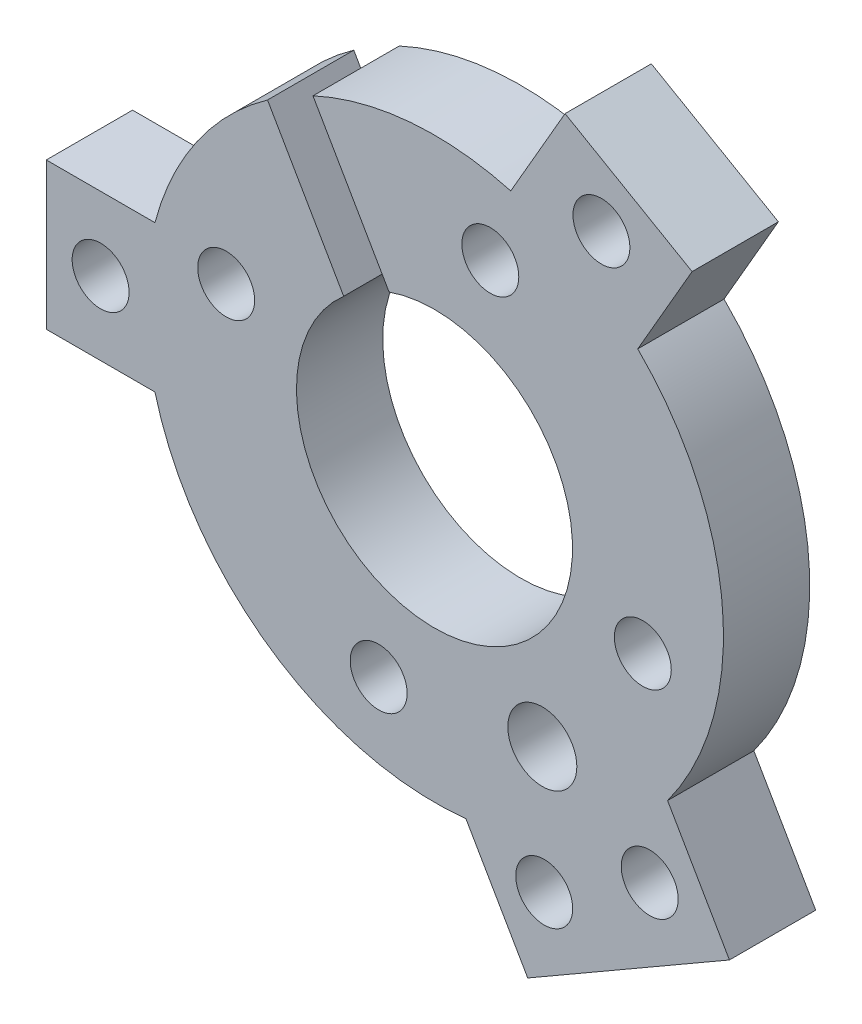
ISO-10303-21;
HEADER;
FILE_DESCRIPTION(('STEP AP214'),'2;1');
FILE_NAME('part.step','',(''),(''),'','','');
FILE_SCHEMA(('AUTOMOTIVE_DESIGN { 1 0 10303 214 1 1 1 1 }'));
ENDSEC;
DATA;
#1=APPLICATION_CONTEXT('core data for automotive mechanical design processes');
#2=APPLICATION_PROTOCOL_DEFINITION('international standard','automotive_design',2000,#1);
#3=PRODUCT_CONTEXT('',#1,'mechanical');
#4=PRODUCT('Part','Part','',(#3));
#5=PRODUCT_RELATED_PRODUCT_CATEGORY('part','',(#4));
#6=PRODUCT_DEFINITION_FORMATION('','',#4);
#7=PRODUCT_DEFINITION_CONTEXT('part definition',#1,'design');
#8=PRODUCT_DEFINITION('design','',#6,#7);
#9=PRODUCT_DEFINITION_SHAPE('','',#8);
#10=(LENGTH_UNIT() NAMED_UNIT(*) SI_UNIT(.MILLI.,.METRE.));
#11=(NAMED_UNIT(*) PLANE_ANGLE_UNIT() SI_UNIT($,.RADIAN.));
#12=(NAMED_UNIT(*) SI_UNIT($,.STERADIAN.) SOLID_ANGLE_UNIT());
#13=UNCERTAINTY_MEASURE_WITH_UNIT(LENGTH_MEASURE(1.E-05),#10,'distance_accuracy_value','');
#14=(GEOMETRIC_REPRESENTATION_CONTEXT(3) GLOBAL_UNCERTAINTY_ASSIGNED_CONTEXT((#13)) GLOBAL_UNIT_ASSIGNED_CONTEXT((#10,
#11,#12)) REPRESENTATION_CONTEXT('',''));
#15=CARTESIAN_POINT('',(0.,0.,0.));
#16=DIRECTION('',(0.,0.,1.));
#17=DIRECTION('',(1.,0.,0.));
#18=AXIS2_PLACEMENT_3D('',#15,#16,#17);
#19=CARTESIAN_POINT('',(0.,0.,10.));
#20=DIRECTION('',(0.,0.,-1.));
#21=DIRECTION('',(-1.,0.,0.));
#22=AXIS2_PLACEMENT_3D('',#19,#20,#21);
#23=CYLINDRICAL_SURFACE('',#22,33.5);
#24=DIRECTION('',(0.,0.,-1.));
#25=VECTOR('',#24,1.);
#26=CARTESIAN_POINT('',(-14.0867530310639,30.3942986272395,10.));
#27=LINE('',#26,#25);
#28=CARTESIAN_POINT('',(-14.0867530310639,30.3942986272395,10.));
#29=VERTEX_POINT('',#28);
#30=CARTESIAN_POINT('',(-14.0867530310639,30.3942986272395,0.));
#31=VERTEX_POINT('',#30);
#32=EDGE_CURVE('E80',#29,#31,#27,.T.);
#33=ORIENTED_EDGE('',*,*,#32,.F.);
#34=CARTESIAN_POINT('',(0.,0.,10.));
#35=DIRECTION('',(0.,0.,1.));
#36=DIRECTION('',(1.,0.,0.));
#37=AXIS2_PLACEMENT_3D('',#34,#35,#36);
#38=CIRCLE('',#37,33.5);
#39=CARTESIAN_POINT('',(8.84063581385193,32.3124304008046,10.));
#40=VERTEX_POINT('',#39);
#41=EDGE_CURVE('E183',#40,#29,#38,.T.);
#42=ORIENTED_EDGE('',*,*,#41,.F.);
#43=DIRECTION('',(0.,0.,-1.));
#44=VECTOR('',#43,1.);
#45=CARTESIAN_POINT('',(8.84063581385193,32.3124304008046,10.));
#46=LINE('',#45,#44);
#47=CARTESIAN_POINT('',(8.84063581385193,32.3124304008046,0.));
#48=VERTEX_POINT('',#47);
#49=EDGE_CURVE('E235',#40,#48,#46,.T.);
#50=ORIENTED_EDGE('',*,*,#49,.T.);
#51=CARTESIAN_POINT('',(0.,0.,0.));
#52=DIRECTION('',(0.,0.,1.));
#53=DIRECTION('',(1.,0.,0.));
#54=AXIS2_PLACEMENT_3D('',#51,#52,#53);
#55=CIRCLE('',#54,33.5);
#56=EDGE_CURVE('E226',#48,#31,#55,.T.);
#57=ORIENTED_EDGE('',*,*,#56,.T.);
#58=EDGE_LOOP('',(#33,#42,#50,#57));
#59=FACE_BOUND('',#58,.T.);
#60=ADVANCED_FACE('F65',(#59),#23,.T.);
#61=CARTESIAN_POINT('',(-32.4037034920393,-8.5,0.));
#62=VERTEX_POINT('',#61);
#63=CARTESIAN_POINT('',(3.638366765666,-33.3018360947035,0.));
#64=VERTEX_POINT('',#63);
#65=EDGE_CURVE('E202',#62,#64,#55,.T.);
#66=ORIENTED_EDGE('',*,*,#65,.T.);
#67=DIRECTION('',(0.,0.,-1.));
#68=VECTOR('',#67,1.);
#69=CARTESIAN_POINT('',(3.638366765666,-33.3018360947035,10.));
#70=LINE('',#69,#68);
#71=CARTESIAN_POINT('',(3.638366765666,-33.3018360947035,10.));
#72=VERTEX_POINT('',#71);
#73=EDGE_CURVE('E250',#72,#64,#70,.T.);
#74=ORIENTED_EDGE('',*,*,#73,.F.);
#75=CARTESIAN_POINT('',(-32.4037034920393,-8.5,10.));
#76=VERTEX_POINT('',#75);
#77=EDGE_CURVE('E231',#76,#72,#38,.T.);
#78=ORIENTED_EDGE('',*,*,#77,.F.);
#79=DIRECTION('',(0.,0.,-1.));
#80=VECTOR('',#79,1.);
#81=CARTESIAN_POINT('',(-32.4037034920393,-8.5,10.));
#82=LINE('',#81,#80);
#83=EDGE_CURVE('E89',#76,#62,#82,.T.);
#84=ORIENTED_EDGE('',*,*,#83,.T.);
#85=EDGE_LOOP('',(#66,#74,#78,#84));
#86=FACE_BOUND('',#85,.T.);
#87=ADVANCED_FACE('F347',(#86),#23,.T.);
#88=CARTESIAN_POINT('',(-11.6913429510899,-6.75000000000002,10.));
#89=DIRECTION('',(0.866025403784438,0.500000000000001,0.));
#90=DIRECTION('',(-0.500000000000001,0.866025403784438,0.));
#91=AXIS2_PLACEMENT_3D('',#88,#89,#90);
#92=PLANE('',#91);
#93=DIRECTION('',(0.500000000000001,-0.866025403784438,0.));
#94=VECTOR('',#93,1.);
#95=CARTESIAN_POINT('',(-11.6913429510899,-6.75000000000002,0.));
#96=LINE('',#95,#94);
#97=CARTESIAN_POINT('',(10.8086570489101,-45.7211431702997,0.));
#98=VERTEX_POINT('',#97);
#99=EDGE_CURVE('E204',#64,#98,#96,.T.);
#100=ORIENTED_EDGE('',*,*,#99,.T.);
#101=DIRECTION('',(0.,0.,-1.));
#102=VECTOR('',#101,1.);
#103=CARTESIAN_POINT('',(10.8086570489101,-45.7211431702997,10.));
#104=LINE('',#103,#102);
#105=CARTESIAN_POINT('',(10.8086570489101,-45.7211431702997,10.));
#106=VERTEX_POINT('',#105);
#107=EDGE_CURVE('E248',#106,#98,#104,.T.);
#108=ORIENTED_EDGE('',*,*,#107,.F.);
#109=DIRECTION('',(0.500000000000001,-0.866025403784438,0.));
#110=VECTOR('',#109,1.);
#111=CARTESIAN_POINT('',(-11.6913429510899,-6.75000000000002,10.));
#112=LINE('',#111,#110);
#113=EDGE_CURVE('E141',#72,#106,#112,.T.);
#114=ORIENTED_EDGE('',*,*,#113,.F.);
#115=ORIENTED_EDGE('',*,*,#73,.T.);
#116=EDGE_LOOP('',(#100,#108,#114,#115));
#117=FACE_BOUND('',#116,.T.);
#118=ADVANCED_FACE('F67',(#117),#92,.F.);
#119=CARTESIAN_POINT('',(22.5,-38.9711431702997,10.));
#120=DIRECTION('',(0.5,-0.866025403784438,0.));
#121=DIRECTION('',(0.866025403784439,0.5,0.));
#122=AXIS2_PLACEMENT_3D('',#119,#120,#121);
#123=PLANE('',#122);
#124=DIRECTION('',(-0.866025403784439,-0.5,0.));
#125=VECTOR('',#124,1.);
#126=CARTESIAN_POINT('',(22.5,-38.9711431702997,0.));
#127=LINE('',#126,#125);
#128=CARTESIAN_POINT('',(34.1913429510899,-32.2211431702997,0.));
#129=VERTEX_POINT('',#128);
#130=EDGE_CURVE('E210',#129,#98,#127,.T.);
#131=ORIENTED_EDGE('',*,*,#130,.F.);
#132=DIRECTION('',(0.,0.,-1.));
#133=VECTOR('',#132,1.);
#134=CARTESIAN_POINT('',(34.1913429510899,-32.2211431702997,10.));
#135=LINE('',#134,#133);
#136=CARTESIAN_POINT('',(34.1913429510899,-32.2211431702997,10.));
#137=VERTEX_POINT('',#136);
#138=EDGE_CURVE('E246',#137,#129,#135,.T.);
#139=ORIENTED_EDGE('',*,*,#138,.F.);
#140=DIRECTION('',(-0.866025403784439,-0.5,0.));
#141=VECTOR('',#140,1.);
#142=CARTESIAN_POINT('',(22.5,-38.9711431702997,10.));
#143=LINE('',#142,#141);
#144=EDGE_CURVE('E297',#137,#106,#143,.T.);
#145=ORIENTED_EDGE('',*,*,#144,.T.);
#146=ORIENTED_EDGE('',*,*,#107,.T.);
#147=EDGE_LOOP('',(#131,#139,#145,#146));
#148=FACE_BOUND('',#147,.T.);
#149=ADVANCED_FACE('F351',(#148),#123,.T.);
#150=CARTESIAN_POINT('',(11.69134295109,6.75,10.));
#151=DIRECTION('',(0.866025403784439,0.499999999999999,0.));
#152=DIRECTION('',(-0.499999999999999,0.866025403784439,0.));
#153=AXIS2_PLACEMENT_3D('',#150,#151,#152);
#154=PLANE('',#153);
#155=DIRECTION('',(0.499999999999999,-0.866025403784439,0.));
#156=VECTOR('',#155,1.);
#157=CARTESIAN_POINT('',(11.69134295109,6.75,0.));
#158=LINE('',#157,#156);
#159=CARTESIAN_POINT('',(27.0210526678458,-19.8018360947035,0.));
#160=VERTEX_POINT('',#159);
#161=EDGE_CURVE('E213',#160,#129,#158,.T.);
#162=ORIENTED_EDGE('',*,*,#161,.F.);
#163=DIRECTION('',(0.,0.,-1.));
#164=VECTOR('',#163,1.);
#165=CARTESIAN_POINT('',(27.0210526678458,-19.8018360947035,10.));
#166=LINE('',#165,#164);
#167=CARTESIAN_POINT('',(27.0210526678458,-19.8018360947035,10.));
#168=VERTEX_POINT('',#167);
#169=EDGE_CURVE('E244',#168,#160,#166,.T.);
#170=ORIENTED_EDGE('',*,*,#169,.F.);
#171=DIRECTION('',(0.499999999999999,-0.866025403784439,0.));
#172=VECTOR('',#171,1.);
#173=CARTESIAN_POINT('',(11.69134295109,6.75,10.));
#174=LINE('',#173,#172);
#175=EDGE_CURVE('E300',#168,#137,#174,.T.);
#176=ORIENTED_EDGE('',*,*,#175,.T.);
#177=ORIENTED_EDGE('',*,*,#138,.T.);
#178=EDGE_LOOP('',(#162,#170,#176,#177));
#179=FACE_BOUND('',#178,.T.);
#180=ADVANCED_FACE('F353',(#179),#154,.T.);
#181=CARTESIAN_POINT('',(23.5630676781874,23.8124304008046,0.));
#182=VERTEX_POINT('',#181);
#183=EDGE_CURVE('E207',#160,#182,#55,.T.);
#184=ORIENTED_EDGE('',*,*,#183,.T.);
#185=DIRECTION('',(0.,0.,-1.));
#186=VECTOR('',#185,1.);
#187=CARTESIAN_POINT('',(23.5630676781874,23.8124304008046,10.));
#188=LINE('',#187,#186);
#189=CARTESIAN_POINT('',(23.5630676781874,23.8124304008046,10.));
#190=VERTEX_POINT('',#189);
#191=EDGE_CURVE('E242',#190,#182,#188,.T.);
#192=ORIENTED_EDGE('',*,*,#191,.F.);
#193=EDGE_CURVE('E295',#168,#190,#38,.T.);
#194=ORIENTED_EDGE('',*,*,#193,.F.);
#195=ORIENTED_EDGE('',*,*,#169,.T.);
#196=EDGE_LOOP('',(#184,#192,#194,#195));
#197=FACE_BOUND('',#196,.T.);
#198=ADVANCED_FACE('F321',(#197),#23,.T.);
#199=CARTESIAN_POINT('',(7.36121593216774,-4.25,10.));
#200=DIRECTION('',(0.866025403784439,-0.5,0.));
#201=DIRECTION('',(0.5,0.866025403784439,0.));
#202=AXIS2_PLACEMENT_3D('',#199,#200,#201);
#203=PLANE('',#202);
#204=DIRECTION('',(-0.5,-0.866025403784439,0.));
#205=VECTOR('',#204,1.);
#206=CARTESIAN_POINT('',(7.36121593216774,-4.25,0.));
#207=LINE('',#206,#205);
#208=CARTESIAN_POINT('',(29.8612159321677,34.7211431702997,0.));
#209=VERTEX_POINT('',#208);
#210=EDGE_CURVE('E216',#209,#182,#207,.T.);
#211=ORIENTED_EDGE('',*,*,#210,.F.);
#212=DIRECTION('',(0.,0.,-1.));
#213=VECTOR('',#212,1.);
#214=CARTESIAN_POINT('',(29.8612159321677,34.7211431702997,10.));
#215=LINE('',#214,#213);
#216=CARTESIAN_POINT('',(29.8612159321677,34.7211431702997,10.));
#217=VERTEX_POINT('',#216);
#218=EDGE_CURVE('E240',#217,#209,#215,.T.);
#219=ORIENTED_EDGE('',*,*,#218,.F.);
#220=DIRECTION('',(-0.5,-0.866025403784439,0.));
#221=VECTOR('',#220,1.);
#222=CARTESIAN_POINT('',(7.36121593216774,-4.25,10.));
#223=LINE('',#222,#221);
#224=EDGE_CURVE('E303',#217,#190,#223,.T.);
#225=ORIENTED_EDGE('',*,*,#224,.T.);
#226=ORIENTED_EDGE('',*,*,#191,.T.);
#227=EDGE_LOOP('',(#211,#219,#225,#226));
#228=FACE_BOUND('',#227,.T.);
#229=ADVANCED_FACE('F325',(#228),#203,.T.);
#230=CARTESIAN_POINT('',(22.5,38.9711431702997,10.));
#231=DIRECTION('',(0.5,0.866025403784439,0.));
#232=DIRECTION('',(-0.866025403784439,0.5,0.));
#233=AXIS2_PLACEMENT_3D('',#230,#231,#232);
#234=PLANE('',#233);
#235=DIRECTION('',(0.866025403784439,-0.5,0.));
#236=VECTOR('',#235,1.);
#237=CARTESIAN_POINT('',(22.5,38.9711431702997,0.));
#238=LINE('',#237,#236);
#239=CARTESIAN_POINT('',(15.1387840678323,43.2211431702997,0.));
#240=VERTEX_POINT('',#239);
#241=EDGE_CURVE('E219',#240,#209,#238,.T.);
#242=ORIENTED_EDGE('',*,*,#241,.F.);
#243=DIRECTION('',(0.,0.,-1.));
#244=VECTOR('',#243,1.);
#245=CARTESIAN_POINT('',(15.1387840678323,43.2211431702997,10.));
#246=LINE('',#245,#244);
#247=CARTESIAN_POINT('',(15.1387840678323,43.2211431702997,10.));
#248=VERTEX_POINT('',#247);
#249=EDGE_CURVE('E238',#248,#240,#246,.T.);
#250=ORIENTED_EDGE('',*,*,#249,.F.);
#251=DIRECTION('',(0.866025403784439,-0.5,0.));
#252=VECTOR('',#251,1.);
#253=CARTESIAN_POINT('',(22.5,38.9711431702997,10.));
#254=LINE('',#253,#252);
#255=EDGE_CURVE('E306',#248,#217,#254,.T.);
#256=ORIENTED_EDGE('',*,*,#255,.T.);
#257=ORIENTED_EDGE('',*,*,#218,.T.);
#258=EDGE_LOOP('',(#242,#250,#256,#257));
#259=FACE_BOUND('',#258,.T.);
#260=ADVANCED_FACE('F328',(#259),#234,.T.);
#261=CARTESIAN_POINT('',(-7.36121593216773,4.25,10.));
#262=DIRECTION('',(0.866025403784439,-0.5,0.));
#263=DIRECTION('',(0.5,0.866025403784439,0.));
#264=AXIS2_PLACEMENT_3D('',#261,#262,#263);
#265=PLANE('',#264);
#266=DIRECTION('',(-0.5,-0.866025403784439,0.));
#267=VECTOR('',#266,1.);
#268=CARTESIAN_POINT('',(-7.36121593216773,4.25,0.));
#269=LINE('',#268,#267);
#270=EDGE_CURVE('E222',#240,#48,#269,.T.);
#271=ORIENTED_EDGE('',*,*,#270,.T.);
#272=ORIENTED_EDGE('',*,*,#49,.F.);
#273=DIRECTION('',(-0.5,-0.866025403784439,0.));
#274=VECTOR('',#273,1.);
#275=CARTESIAN_POINT('',(-7.36121593216773,4.25,10.));
#276=LINE('',#275,#274);
#277=EDGE_CURVE('E308',#248,#40,#276,.T.);
#278=ORIENTED_EDGE('',*,*,#277,.F.);
#279=ORIENTED_EDGE('',*,*,#249,.T.);
#280=EDGE_LOOP('',(#271,#272,#278,#279));
#281=FACE_BOUND('',#280,.T.);
#282=ADVANCED_FACE('F331',(#281),#265,.F.);
#283=CARTESIAN_POINT('',(-19.356217078881,27.3420346791389,10.));
#284=VERTEX_POINT('',#283);
#285=CARTESIAN_POINT('',(-32.4037034920393,8.5,10.));
#286=VERTEX_POINT('',#285);
#287=EDGE_CURVE('E179',#284,#286,#38,.T.);
#288=ORIENTED_EDGE('',*,*,#287,.F.);
#289=DIRECTION('',(0.,0.,-1.));
#290=VECTOR('',#289,1.);
#291=CARTESIAN_POINT('',(-19.356217078881,27.3420346791389,10.));
#292=LINE('',#291,#290);
#293=CARTESIAN_POINT('',(-19.356217078881,27.3420346791389,0.));
#294=VERTEX_POINT('',#293);
#295=EDGE_CURVE('E205',#284,#294,#292,.T.);
#296=ORIENTED_EDGE('',*,*,#295,.T.);
#297=CARTESIAN_POINT('',(-32.4037034920393,8.5,0.));
#298=VERTEX_POINT('',#297);
#299=EDGE_CURVE('E206',#294,#298,#55,.T.);
#300=ORIENTED_EDGE('',*,*,#299,.T.);
#301=DIRECTION('',(0.,0.,-1.));
#302=VECTOR('',#301,1.);
#303=CARTESIAN_POINT('',(-32.4037034920393,8.5,10.));
#304=LINE('',#303,#302);
#305=EDGE_CURVE('E193',#286,#298,#304,.T.);
#306=ORIENTED_EDGE('',*,*,#305,.F.);
#307=EDGE_LOOP('',(#288,#296,#300,#306));
#308=FACE_BOUND('',#307,.T.);
#309=ADVANCED_FACE('F344',(#308),#23,.T.);
#310=CARTESIAN_POINT('',(0.,8.5,10.));
#311=DIRECTION('',(0.,-1.,0.));
#312=DIRECTION('',(0.,0.,-1.));
#313=AXIS2_PLACEMENT_3D('',#310,#311,#312);
#314=PLANE('',#313);
#315=DIRECTION('',(-1.,0.,0.));
#316=VECTOR('',#315,1.);
#317=CARTESIAN_POINT('',(0.,8.5,0.));
#318=LINE('',#317,#316);
#319=CARTESIAN_POINT('',(-45.,8.5,0.));
#320=VERTEX_POINT('',#319);
#321=EDGE_CURVE('E189',#298,#320,#318,.T.);
#322=ORIENTED_EDGE('',*,*,#321,.T.);
#323=DIRECTION('',(0.,0.,-1.));
#324=VECTOR('',#323,1.);
#325=CARTESIAN_POINT('',(-45.,8.5,10.));
#326=LINE('',#325,#324);
#327=CARTESIAN_POINT('',(-45.,8.5,10.));
#328=VERTEX_POINT('',#327);
#329=EDGE_CURVE('E186',#328,#320,#326,.T.);
#330=ORIENTED_EDGE('',*,*,#329,.F.);
#331=DIRECTION('',(-1.,0.,0.));
#332=VECTOR('',#331,1.);
#333=CARTESIAN_POINT('',(0.,8.5,10.));
#334=LINE('',#333,#332);
#335=EDGE_CURVE('E171',#286,#328,#334,.T.);
#336=ORIENTED_EDGE('',*,*,#335,.F.);
#337=ORIENTED_EDGE('',*,*,#305,.T.);
#338=EDGE_LOOP('',(#322,#330,#336,#337));
#339=FACE_BOUND('',#338,.T.);
#340=ADVANCED_FACE('F187',(#339),#314,.F.);
#341=CARTESIAN_POINT('',(-45.,0.,10.));
#342=DIRECTION('',(-1.,0.,0.));
#343=DIRECTION('',(0.,-1.,0.));
#344=AXIS2_PLACEMENT_3D('',#341,#342,#343);
#345=PLANE('',#344);
#346=DIRECTION('',(0.,1.,0.));
#347=VECTOR('',#346,1.);
#348=CARTESIAN_POINT('',(-45.,0.,0.));
#349=LINE('',#348,#347);
#350=CARTESIAN_POINT('',(-45.,-8.5,0.));
#351=VERTEX_POINT('',#350);
#352=EDGE_CURVE('E225',#351,#320,#349,.T.);
#353=ORIENTED_EDGE('',*,*,#352,.F.);
#354=DIRECTION('',(0.,0.,-1.));
#355=VECTOR('',#354,1.);
#356=CARTESIAN_POINT('',(-45.,-8.5,10.));
#357=LINE('',#356,#355);
#358=CARTESIAN_POINT('',(-45.,-8.5,10.));
#359=VERTEX_POINT('',#358);
#360=EDGE_CURVE('E194',#359,#351,#357,.T.);
#361=ORIENTED_EDGE('',*,*,#360,.F.);
#362=DIRECTION('',(0.,1.,0.));
#363=VECTOR('',#362,1.);
#364=CARTESIAN_POINT('',(-45.,0.,10.));
#365=LINE('',#364,#363);
#366=EDGE_CURVE('E177',#359,#328,#365,.T.);
#367=ORIENTED_EDGE('',*,*,#366,.T.);
#368=ORIENTED_EDGE('',*,*,#329,.T.);
#369=EDGE_LOOP('',(#353,#361,#367,#368));
#370=FACE_BOUND('',#369,.T.);
#371=ADVANCED_FACE('F196',(#370),#345,.T.);
#372=CARTESIAN_POINT('',(0.,-8.5,10.));
#373=DIRECTION('',(0.,-1.,0.));
#374=DIRECTION('',(0.,0.,-1.));
#375=AXIS2_PLACEMENT_3D('',#372,#373,#374);
#376=PLANE('',#375);
#377=DIRECTION('',(-1.,0.,0.));
#378=VECTOR('',#377,1.);
#379=CARTESIAN_POINT('',(0.,-8.5,0.));
#380=LINE('',#379,#378);
#381=EDGE_CURVE('E228',#62,#351,#380,.T.);
#382=ORIENTED_EDGE('',*,*,#381,.F.);
#383=ORIENTED_EDGE('',*,*,#83,.F.);
#384=DIRECTION('',(-1.,0.,0.));
#385=VECTOR('',#384,1.);
#386=CARTESIAN_POINT('',(0.,-8.5,10.));
#387=LINE('',#386,#385);
#388=EDGE_CURVE('E197',#76,#359,#387,.T.);
#389=ORIENTED_EDGE('',*,*,#388,.T.);
#390=ORIENTED_EDGE('',*,*,#360,.T.);
#391=EDGE_LOOP('',(#382,#383,#389,#390));
#392=FACE_BOUND('',#391,.T.);
#393=ADVANCED_FACE('F345',(#392),#376,.T.);
#394=CARTESIAN_POINT('',(0.,0.,10.));
#395=DIRECTION('',(0.,0.,1.));
#396=DIRECTION('',(1.,0.,0.));
#397=AXIS2_PLACEMENT_3D('',#394,#395,#396);
#398=PLANE('',#397);
#399=CARTESIAN_POINT('',(19.3509258730098,33.5167867855521,10.));
#400=DIRECTION('',(0.,0.,1.));
#401=DIRECTION('',(1.,0.,0.));
#402=AXIS2_PLACEMENT_3D('',#399,#400,#401);
#403=CIRCLE('',#402,3.3);
#404=CARTESIAN_POINT('',(22.6509258730098,33.5167867855521,10.));
#405=VERTEX_POINT('',#404);
#406=EDGE_CURVE('E580',#405,#405,#403,.T.);
#407=ORIENTED_EDGE('',*,*,#406,.F.);
#408=EDGE_LOOP('',(#407));
#409=FACE_BOUND('',#408,.T.);
#410=CARTESIAN_POINT('',(6.47047612756268,24.1481456572268,10.));
#411=DIRECTION('',(0.,0.,1.));
#412=DIRECTION('',(1.,0.,0.));
#413=AXIS2_PLACEMENT_3D('',#410,#411,#412);
#414=CIRCLE('',#413,3.30000000000002);
#415=CARTESIAN_POINT('',(9.7704761275627,24.1481456572268,10.));
#416=VERTEX_POINT('',#415);
#417=EDGE_CURVE('E601',#416,#416,#414,.T.);
#418=ORIENTED_EDGE('',*,*,#417,.F.);
#419=EDGE_LOOP('',(#418));
#420=FACE_BOUND('',#419,.T.);
#421=CARTESIAN_POINT('',(-6.47047612756268,-24.1481456572268,10.));
#422=DIRECTION('',(0.,0.,1.));
#423=DIRECTION('',(1.,0.,0.));
#424=AXIS2_PLACEMENT_3D('',#421,#422,#423);
#425=CIRCLE('',#424,3.3);
#426=CARTESIAN_POINT('',(-3.17047612756268,-24.1481456572268,10.));
#427=VERTEX_POINT('',#426);
#428=EDGE_CURVE('E590',#427,#427,#425,.T.);
#429=ORIENTED_EDGE('',*,*,#428,.F.);
#430=EDGE_LOOP('',(#429));
#431=FACE_BOUND('',#430,.T.);
#432=CARTESIAN_POINT('',(24.1481456572268,-6.47047612756268,10.));
#433=DIRECTION('',(0.,0.,1.));
#434=DIRECTION('',(1.,0.,0.));
#435=AXIS2_PLACEMENT_3D('',#432,#433,#434);
#436=CIRCLE('',#435,3.3);
#437=CARTESIAN_POINT('',(27.4481456572268,-6.47047612756268,10.));
#438=VERTEX_POINT('',#437);
#439=EDGE_CURVE('E589',#438,#438,#436,.T.);
#440=ORIENTED_EDGE('',*,*,#439,.F.);
#441=EDGE_LOOP('',(#440));
#442=FACE_BOUND('',#441,.T.);
#443=CARTESIAN_POINT('',(12.5,-21.650635094611,10.));
#444=DIRECTION('',(0.,0.,1.));
#445=DIRECTION('',(1.,0.,0.));
#446=AXIS2_PLACEMENT_3D('',#443,#444,#445);
#447=CIRCLE('',#446,4.);
#448=CARTESIAN_POINT('',(16.5,-21.650635094611,10.));
#449=VERTEX_POINT('',#448);
#450=EDGE_CURVE('E288',#449,#449,#447,.T.);
#451=ORIENTED_EDGE('',*,*,#450,.F.);
#452=EDGE_LOOP('',(#451));
#453=FACE_BOUND('',#452,.T.);
#454=CARTESIAN_POINT('',(-38.7018517460196,0.,10.));
#455=DIRECTION('',(0.,0.,1.));
#456=DIRECTION('',(1.,0.,0.));
#457=AXIS2_PLACEMENT_3D('',#454,#455,#456);
#458=CIRCLE('',#457,3.3);
#459=CARTESIAN_POINT('',(-35.4018517460196,0.,10.));
#460=VERTEX_POINT('',#459);
#461=EDGE_CURVE('E583',#460,#460,#458,.T.);
#462=ORIENTED_EDGE('',*,*,#461,.F.);
#463=EDGE_LOOP('',(#462));
#464=FACE_BOUND('',#463,.T.);
#465=CARTESIAN_POINT('',(12.7197246937748,-36.1510172537874,10.));
#466=DIRECTION('',(0.,0.,1.));
#467=DIRECTION('',(1.,0.,0.));
#468=AXIS2_PLACEMENT_3D('',#465,#466,#467);
#469=CIRCLE('',#468,3.3);
#470=CARTESIAN_POINT('',(16.0197246937748,-36.1510172537874,10.));
#471=VERTEX_POINT('',#470);
#472=EDGE_CURVE('E614',#471,#471,#469,.T.);
#473=ORIENTED_EDGE('',*,*,#472,.F.);
#474=EDGE_LOOP('',(#473));
#475=FACE_BOUND('',#474,.T.);
#476=CARTESIAN_POINT('',(24.9478369675421,-29.0911133408469,10.));
#477=DIRECTION('',(0.,0.,1.));
#478=DIRECTION('',(1.,0.,0.));
#479=AXIS2_PLACEMENT_3D('',#476,#477,#478);
#480=CIRCLE('',#479,3.3);
#481=CARTESIAN_POINT('',(28.2478369675421,-29.0911133408469,10.));
#482=VERTEX_POINT('',#481);
#483=EDGE_CURVE('E613',#482,#482,#480,.T.);
#484=ORIENTED_EDGE('',*,*,#483,.F.);
#485=EDGE_LOOP('',(#484));
#486=FACE_BOUND('',#485,.T.);
#487=CARTESIAN_POINT('',(-24.1481456572268,6.47047612756268,10.));
#488=DIRECTION('',(0.,0.,1.));
#489=DIRECTION('',(1.,0.,0.));
#490=AXIS2_PLACEMENT_3D('',#487,#488,#489);
#491=CIRCLE('',#490,3.3);
#492=CARTESIAN_POINT('',(-20.8481456572268,6.47047612756268,10.));
#493=VERTEX_POINT('',#492);
#494=EDGE_CURVE('E602',#493,#493,#491,.T.);
#495=ORIENTED_EDGE('',*,*,#494,.F.);
#496=EDGE_LOOP('',(#495));
#497=FACE_BOUND('',#496,.T.);
#498=DIRECTION('',(0.5,-0.866025403784439,0.));
#499=VECTOR('',#498,1.);
#500=CARTESIAN_POINT('',(-19.4869060270967,27.5683945774362,10.));
#501=LINE('',#500,#499);
#502=CARTESIAN_POINT('',(-10.5269149890692,12.0492348642107,10.));
#503=VERTEX_POINT('',#502);
#504=EDGE_CURVE('E280',#284,#503,#501,.T.);
#505=ORIENTED_EDGE('',*,*,#504,.F.);
#506=ORIENTED_EDGE('',*,*,#287,.T.);
#507=ORIENTED_EDGE('',*,*,#335,.T.);
#508=ORIENTED_EDGE('',*,*,#366,.F.);
#509=ORIENTED_EDGE('',*,*,#388,.F.);
#510=ORIENTED_EDGE('',*,*,#77,.T.);
#511=ORIENTED_EDGE('',*,*,#113,.T.);
#512=ORIENTED_EDGE('',*,*,#144,.F.);
#513=ORIENTED_EDGE('',*,*,#175,.F.);
#514=ORIENTED_EDGE('',*,*,#193,.T.);
#515=ORIENTED_EDGE('',*,*,#224,.F.);
#516=ORIENTED_EDGE('',*,*,#255,.F.);
#517=ORIENTED_EDGE('',*,*,#277,.T.);
#518=ORIENTED_EDGE('',*,*,#41,.T.);
#519=DIRECTION('',(0.5,-0.866025403784439,0.));
#520=VECTOR('',#519,1.);
#521=CARTESIAN_POINT('',(-14.2131389321786,30.6132054293306,10.));
#522=LINE('',#521,#520);
#523=CARTESIAN_POINT('',(-5.2622871532816,15.1098753772626,10.));
#524=VERTEX_POINT('',#523);
#525=EDGE_CURVE('E286',#29,#524,#522,.T.);
#526=ORIENTED_EDGE('',*,*,#525,.T.);
#527=CARTESIAN_POINT('',(0.,0.,10.));
#528=DIRECTION('',(0.,0.,1.));
#529=DIRECTION('',(1.,0.,0.));
#530=AXIS2_PLACEMENT_3D('',#527,#528,#529);
#531=CIRCLE('',#530,16.);
#532=EDGE_CURVE('E271',#503,#524,#531,.T.);
#533=ORIENTED_EDGE('',*,*,#532,.F.);
#534=EDGE_LOOP('',(#505,#506,#507,#508,#509,#510,#511,#512,#513,#514,#515,#516,#517,#518,#526,#533));
#535=FACE_BOUND('',#534,.T.);
#536=ADVANCED_FACE('F174',(#409,#420,#431,#442,#453,#464,#475,#486,#497,#535),#398,.T.);
#537=CARTESIAN_POINT('',(0.,0.,0.));
#538=DIRECTION('',(0.,0.,1.));
#539=DIRECTION('',(1.,0.,0.));
#540=AXIS2_PLACEMENT_3D('',#537,#538,#539);
#541=PLANE('',#540);
#542=CARTESIAN_POINT('',(19.3509258730098,33.5167867855521,0.));
#543=DIRECTION('',(0.,0.,1.));
#544=DIRECTION('',(1.,0.,0.));
#545=AXIS2_PLACEMENT_3D('',#542,#543,#544);
#546=CIRCLE('',#545,3.3);
#547=CARTESIAN_POINT('',(22.6509258730098,33.5167867855521,0.));
#548=VERTEX_POINT('',#547);
#549=EDGE_CURVE('E283',#548,#548,#546,.T.);
#550=ORIENTED_EDGE('',*,*,#549,.T.);
#551=EDGE_LOOP('',(#550));
#552=FACE_BOUND('',#551,.T.);
#553=CARTESIAN_POINT('',(6.47047612756268,24.1481456572268,0.));
#554=DIRECTION('',(0.,0.,1.));
#555=DIRECTION('',(1.,0.,0.));
#556=AXIS2_PLACEMENT_3D('',#553,#554,#555);
#557=CIRCLE('',#556,3.30000000000002);
#558=CARTESIAN_POINT('',(9.7704761275627,24.1481456572268,0.));
#559=VERTEX_POINT('',#558);
#560=EDGE_CURVE('E598',#559,#559,#557,.T.);
#561=ORIENTED_EDGE('',*,*,#560,.T.);
#562=EDGE_LOOP('',(#561));
#563=FACE_BOUND('',#562,.T.);
#564=CARTESIAN_POINT('',(-6.47047612756268,-24.1481456572268,0.));
#565=DIRECTION('',(0.,0.,1.));
#566=DIRECTION('',(1.,0.,0.));
#567=AXIS2_PLACEMENT_3D('',#564,#565,#566);
#568=CIRCLE('',#567,3.3);
#569=CARTESIAN_POINT('',(-3.17047612756268,-24.1481456572268,0.));
#570=VERTEX_POINT('',#569);
#571=EDGE_CURVE('E605',#570,#570,#568,.T.);
#572=ORIENTED_EDGE('',*,*,#571,.T.);
#573=EDGE_LOOP('',(#572));
#574=FACE_BOUND('',#573,.T.);
#575=CARTESIAN_POINT('',(24.1481456572268,-6.47047612756268,0.));
#576=DIRECTION('',(0.,0.,1.));
#577=DIRECTION('',(1.,0.,0.));
#578=AXIS2_PLACEMENT_3D('',#575,#576,#577);
#579=CIRCLE('',#578,3.3);
#580=CARTESIAN_POINT('',(27.4481456572268,-6.47047612756268,0.));
#581=VERTEX_POINT('',#580);
#582=EDGE_CURVE('E586',#581,#581,#579,.T.);
#583=ORIENTED_EDGE('',*,*,#582,.T.);
#584=EDGE_LOOP('',(#583));
#585=FACE_BOUND('',#584,.T.);
#586=CARTESIAN_POINT('',(12.5,-21.650635094611,0.));
#587=DIRECTION('',(0.,0.,1.));
#588=DIRECTION('',(1.,0.,0.));
#589=AXIS2_PLACEMENT_3D('',#586,#587,#588);
#590=CIRCLE('',#589,4.);
#591=CARTESIAN_POINT('',(16.5,-21.650635094611,0.));
#592=VERTEX_POINT('',#591);
#593=EDGE_CURVE('E593',#592,#592,#590,.T.);
#594=ORIENTED_EDGE('',*,*,#593,.T.);
#595=EDGE_LOOP('',(#594));
#596=FACE_BOUND('',#595,.T.);
#597=CARTESIAN_POINT('',(-38.7018517460196,0.,0.));
#598=DIRECTION('',(0.,0.,1.));
#599=DIRECTION('',(1.,0.,0.));
#600=AXIS2_PLACEMENT_3D('',#597,#598,#599);
#601=CIRCLE('',#600,3.3);
#602=CARTESIAN_POINT('',(-35.4018517460196,0.,0.));
#603=VERTEX_POINT('',#602);
#604=EDGE_CURVE('E581',#603,#603,#601,.T.);
#605=ORIENTED_EDGE('',*,*,#604,.T.);
#606=EDGE_LOOP('',(#605));
#607=FACE_BOUND('',#606,.T.);
#608=CARTESIAN_POINT('',(12.7197246937748,-36.1510172537874,0.));
#609=DIRECTION('',(0.,0.,1.));
#610=DIRECTION('',(1.,0.,0.));
#611=AXIS2_PLACEMENT_3D('',#608,#609,#610);
#612=CIRCLE('',#611,3.3);
#613=CARTESIAN_POINT('',(16.0197246937748,-36.1510172537874,0.));
#614=VERTEX_POINT('',#613);
#615=EDGE_CURVE('E624',#614,#614,#612,.T.);
#616=ORIENTED_EDGE('',*,*,#615,.T.);
#617=EDGE_LOOP('',(#616));
#618=FACE_BOUND('',#617,.T.);
#619=CARTESIAN_POINT('',(24.9478369675421,-29.0911133408469,0.));
#620=DIRECTION('',(0.,0.,1.));
#621=DIRECTION('',(1.,0.,0.));
#622=AXIS2_PLACEMENT_3D('',#619,#620,#621);
#623=CIRCLE('',#622,3.3);
#624=CARTESIAN_POINT('',(28.2478369675421,-29.0911133408469,0.));
#625=VERTEX_POINT('',#624);
#626=EDGE_CURVE('E610',#625,#625,#623,.T.);
#627=ORIENTED_EDGE('',*,*,#626,.T.);
#628=EDGE_LOOP('',(#627));
#629=FACE_BOUND('',#628,.T.);
#630=CARTESIAN_POINT('',(-24.1481456572268,6.47047612756268,0.));
#631=DIRECTION('',(0.,0.,1.));
#632=DIRECTION('',(1.,0.,0.));
#633=AXIS2_PLACEMENT_3D('',#630,#631,#632);
#634=CIRCLE('',#633,3.3);
#635=CARTESIAN_POINT('',(-20.8481456572268,6.47047612756268,0.));
#636=VERTEX_POINT('',#635);
#637=EDGE_CURVE('E617',#636,#636,#634,.T.);
#638=ORIENTED_EDGE('',*,*,#637,.T.);
#639=EDGE_LOOP('',(#638));
#640=FACE_BOUND('',#639,.T.);
#641=ORIENTED_EDGE('',*,*,#299,.F.);
#642=DIRECTION('',(0.5,-0.866025403784439,0.));
#643=VECTOR('',#642,1.);
#644=CARTESIAN_POINT('',(-2.67771449751607,-1.54597918595387,0.));
#645=LINE('',#644,#643);
#646=CARTESIAN_POINT('',(-10.5269149890692,12.0492348642107,0.));
#647=VERTEX_POINT('',#646);
#648=EDGE_CURVE('E12',#294,#647,#645,.T.);
#649=ORIENTED_EDGE('',*,*,#648,.T.);
#650=CARTESIAN_POINT('',(0.,0.,0.));
#651=DIRECTION('',(0.,0.,1.));
#652=DIRECTION('',(1.,0.,0.));
#653=AXIS2_PLACEMENT_3D('',#650,#651,#652);
#654=CIRCLE('',#653,16.);
#655=CARTESIAN_POINT('',(-5.2622871532816,15.1098753772626,0.));
#656=VERTEX_POINT('',#655);
#657=EDGE_CURVE('E269',#647,#656,#654,.T.);
#658=ORIENTED_EDGE('',*,*,#657,.T.);
#659=DIRECTION('',(0.5,-0.866025403784439,0.));
#660=VECTOR('',#659,1.);
#661=CARTESIAN_POINT('',(2.59605259740201,1.49883166594048,0.));
#662=LINE('',#661,#660);
#663=EDGE_CURVE('E73',#31,#656,#662,.T.);
#664=ORIENTED_EDGE('',*,*,#663,.F.);
#665=ORIENTED_EDGE('',*,*,#56,.F.);
#666=ORIENTED_EDGE('',*,*,#270,.F.);
#667=ORIENTED_EDGE('',*,*,#241,.T.);
#668=ORIENTED_EDGE('',*,*,#210,.T.);
#669=ORIENTED_EDGE('',*,*,#183,.F.);
#670=ORIENTED_EDGE('',*,*,#161,.T.);
#671=ORIENTED_EDGE('',*,*,#130,.T.);
#672=ORIENTED_EDGE('',*,*,#99,.F.);
#673=ORIENTED_EDGE('',*,*,#65,.F.);
#674=ORIENTED_EDGE('',*,*,#381,.T.);
#675=ORIENTED_EDGE('',*,*,#352,.T.);
#676=ORIENTED_EDGE('',*,*,#321,.F.);
#677=EDGE_LOOP('',(#641,#649,#658,#664,#665,#666,#667,#668,#669,#670,#671,#672,#673,#674,#675,#676));
#678=FACE_BOUND('',#677,.T.);
#679=ADVANCED_FACE('F276',(#552,#563,#574,#585,#596,#607,#618,#629,#640,#678),#541,.F.);
#680=CARTESIAN_POINT('',(-19.4869060270967,27.5683945774362,0.));
#681=DIRECTION('',(-0.866025403784439,-0.5,0.));
#682=DIRECTION('',(0.5,-0.866025403784439,0.));
#683=AXIS2_PLACEMENT_3D('',#680,#681,#682);
#684=PLANE('',#683);
#685=ORIENTED_EDGE('',*,*,#504,.T.);
#686=DIRECTION('',(0.,0.,1.));
#687=VECTOR('',#686,1.);
#688=CARTESIAN_POINT('',(-10.5269149890692,12.0492348642107,0.));
#689=LINE('',#688,#687);
#690=EDGE_CURVE('E273',#647,#503,#689,.T.);
#691=ORIENTED_EDGE('',*,*,#690,.F.);
#692=ORIENTED_EDGE('',*,*,#648,.F.);
#693=ORIENTED_EDGE('',*,*,#295,.F.);
#694=EDGE_LOOP('',(#685,#691,#692,#693));
#695=FACE_BOUND('',#694,.T.);
#696=ADVANCED_FACE('F341',(#695),#684,.F.);
#697=CARTESIAN_POINT('',(-14.2131389321786,30.6132054293306,0.));
#698=DIRECTION('',(-0.866025403784438,-0.5,0.));
#699=DIRECTION('',(0.5,-0.866025403784439,0.));
#700=AXIS2_PLACEMENT_3D('',#697,#698,#699);
#701=PLANE('',#700);
#702=ORIENTED_EDGE('',*,*,#32,.T.);
#703=ORIENTED_EDGE('',*,*,#663,.T.);
#704=DIRECTION('',(0.,0.,1.));
#705=VECTOR('',#704,1.);
#706=CARTESIAN_POINT('',(-5.2622871532816,15.1098753772626,0.));
#707=LINE('',#706,#705);
#708=EDGE_CURVE('E256',#656,#524,#707,.T.);
#709=ORIENTED_EDGE('',*,*,#708,.T.);
#710=ORIENTED_EDGE('',*,*,#525,.F.);
#711=EDGE_LOOP('',(#702,#703,#709,#710));
#712=FACE_BOUND('',#711,.T.);
#713=ADVANCED_FACE('F254',(#712),#701,.T.);
#714=CARTESIAN_POINT('',(0.,0.,0.));
#715=DIRECTION('',(0.,0.,1.));
#716=DIRECTION('',(1.,0.,0.));
#717=AXIS2_PLACEMENT_3D('',#714,#715,#716);
#718=CYLINDRICAL_SURFACE('',#717,16.);
#719=ORIENTED_EDGE('',*,*,#532,.T.);
#720=ORIENTED_EDGE('',*,*,#708,.F.);
#721=ORIENTED_EDGE('',*,*,#657,.F.);
#722=ORIENTED_EDGE('',*,*,#690,.T.);
#723=EDGE_LOOP('',(#719,#720,#721,#722));
#724=FACE_BOUND('',#723,.T.);
#725=ADVANCED_FACE('F267',(#724),#718,.F.);
#726=CARTESIAN_POINT('',(-24.1481456572268,6.47047612756268,0.));
#727=DIRECTION('',(0.,0.,1.));
#728=DIRECTION('',(1.,0.,0.));
#729=AXIS2_PLACEMENT_3D('',#726,#727,#728);
#730=CYLINDRICAL_SURFACE('',#729,3.3);
#731=ORIENTED_EDGE('',*,*,#637,.F.);
#732=EDGE_LOOP('',(#731));
#733=FACE_BOUND('',#732,.T.);
#734=ORIENTED_EDGE('',*,*,#494,.T.);
#735=EDGE_LOOP('',(#734));
#736=FACE_BOUND('',#735,.T.);
#737=ADVANCED_FACE('F483',(#733,#736),#730,.F.);
#738=CARTESIAN_POINT('',(24.9478369675421,-29.0911133408469,0.));
#739=DIRECTION('',(0.,0.,1.));
#740=DIRECTION('',(1.,0.,0.));
#741=AXIS2_PLACEMENT_3D('',#738,#739,#740);
#742=CYLINDRICAL_SURFACE('',#741,3.3);
#743=ORIENTED_EDGE('',*,*,#626,.F.);
#744=EDGE_LOOP('',(#743));
#745=FACE_BOUND('',#744,.T.);
#746=ORIENTED_EDGE('',*,*,#483,.T.);
#747=EDGE_LOOP('',(#746));
#748=FACE_BOUND('',#747,.T.);
#749=ADVANCED_FACE('F492',(#745,#748),#742,.F.);
#750=CARTESIAN_POINT('',(12.7197246937748,-36.1510172537874,0.));
#751=DIRECTION('',(0.,0.,1.));
#752=DIRECTION('',(1.,0.,0.));
#753=AXIS2_PLACEMENT_3D('',#750,#751,#752);
#754=CYLINDRICAL_SURFACE('',#753,3.3);
#755=ORIENTED_EDGE('',*,*,#615,.F.);
#756=EDGE_LOOP('',(#755));
#757=FACE_BOUND('',#756,.T.);
#758=ORIENTED_EDGE('',*,*,#472,.T.);
#759=EDGE_LOOP('',(#758));
#760=FACE_BOUND('',#759,.T.);
#761=ADVANCED_FACE('F502',(#757,#760),#754,.F.);
#762=CARTESIAN_POINT('',(-38.7018517460196,0.,0.));
#763=DIRECTION('',(0.,0.,1.));
#764=DIRECTION('',(1.,0.,0.));
#765=AXIS2_PLACEMENT_3D('',#762,#763,#764);
#766=CYLINDRICAL_SURFACE('',#765,3.3);
#767=ORIENTED_EDGE('',*,*,#604,.F.);
#768=EDGE_LOOP('',(#767));
#769=FACE_BOUND('',#768,.T.);
#770=ORIENTED_EDGE('',*,*,#461,.T.);
#771=EDGE_LOOP('',(#770));
#772=FACE_BOUND('',#771,.T.);
#773=ADVANCED_FACE('F512',(#769,#772),#766,.F.);
#774=CARTESIAN_POINT('',(12.5,-21.650635094611,0.));
#775=DIRECTION('',(0.,0.,1.));
#776=DIRECTION('',(1.,0.,0.));
#777=AXIS2_PLACEMENT_3D('',#774,#775,#776);
#778=CYLINDRICAL_SURFACE('',#777,4.);
#779=ORIENTED_EDGE('',*,*,#593,.F.);
#780=EDGE_LOOP('',(#779));
#781=FACE_BOUND('',#780,.T.);
#782=ORIENTED_EDGE('',*,*,#450,.T.);
#783=EDGE_LOOP('',(#782));
#784=FACE_BOUND('',#783,.T.);
#785=ADVANCED_FACE('F522',(#781,#784),#778,.F.);
#786=CARTESIAN_POINT('',(24.1481456572268,-6.47047612756268,0.));
#787=DIRECTION('',(0.,0.,1.));
#788=DIRECTION('',(1.,0.,0.));
#789=AXIS2_PLACEMENT_3D('',#786,#787,#788);
#790=CYLINDRICAL_SURFACE('',#789,3.3);
#791=ORIENTED_EDGE('',*,*,#582,.F.);
#792=EDGE_LOOP('',(#791));
#793=FACE_BOUND('',#792,.T.);
#794=ORIENTED_EDGE('',*,*,#439,.T.);
#795=EDGE_LOOP('',(#794));
#796=FACE_BOUND('',#795,.T.);
#797=ADVANCED_FACE('F532',(#793,#796),#790,.F.);
#798=CARTESIAN_POINT('',(-6.47047612756268,-24.1481456572268,0.));
#799=DIRECTION('',(0.,0.,1.));
#800=DIRECTION('',(1.,0.,0.));
#801=AXIS2_PLACEMENT_3D('',#798,#799,#800);
#802=CYLINDRICAL_SURFACE('',#801,3.3);
#803=ORIENTED_EDGE('',*,*,#571,.F.);
#804=EDGE_LOOP('',(#803));
#805=FACE_BOUND('',#804,.T.);
#806=ORIENTED_EDGE('',*,*,#428,.T.);
#807=EDGE_LOOP('',(#806));
#808=FACE_BOUND('',#807,.T.);
#809=ADVANCED_FACE('F542',(#805,#808),#802,.F.);
#810=CARTESIAN_POINT('',(6.47047612756268,24.1481456572268,0.));
#811=DIRECTION('',(0.,0.,1.));
#812=DIRECTION('',(1.,0.,0.));
#813=AXIS2_PLACEMENT_3D('',#810,#811,#812);
#814=CYLINDRICAL_SURFACE('',#813,3.30000000000002);
#815=ORIENTED_EDGE('',*,*,#560,.F.);
#816=EDGE_LOOP('',(#815));
#817=FACE_BOUND('',#816,.T.);
#818=ORIENTED_EDGE('',*,*,#417,.T.);
#819=EDGE_LOOP('',(#818));
#820=FACE_BOUND('',#819,.T.);
#821=ADVANCED_FACE('F552',(#817,#820),#814,.F.);
#822=CARTESIAN_POINT('',(19.3509258730098,33.5167867855521,0.));
#823=DIRECTION('',(0.,0.,1.));
#824=DIRECTION('',(1.,0.,0.));
#825=AXIS2_PLACEMENT_3D('',#822,#823,#824);
#826=CYLINDRICAL_SURFACE('',#825,3.3);
#827=ORIENTED_EDGE('',*,*,#549,.F.);
#828=EDGE_LOOP('',(#827));
#829=FACE_BOUND('',#828,.T.);
#830=ORIENTED_EDGE('',*,*,#406,.T.);
#831=EDGE_LOOP('',(#830));
#832=FACE_BOUND('',#831,.T.);
#833=ADVANCED_FACE('F562',(#829,#832),#826,.F.);
#834=CLOSED_SHELL('',(#60,#87,#118,#149,#180,#198,#229,#260,#282,#309,#340,#371,#393,#536,#679,
#696,#713,#725,#737,#749,#761,#773,#785,#797,#809,#821,#833));
#835=MANIFOLD_SOLID_BREP('B2',#834);
#836=ADVANCED_BREP_SHAPE_REPRESENTATION('',(#18,#835),#14);
#837=SHAPE_DEFINITION_REPRESENTATION(#9,#836);
ENDSEC;
END-ISO-10303-21;
